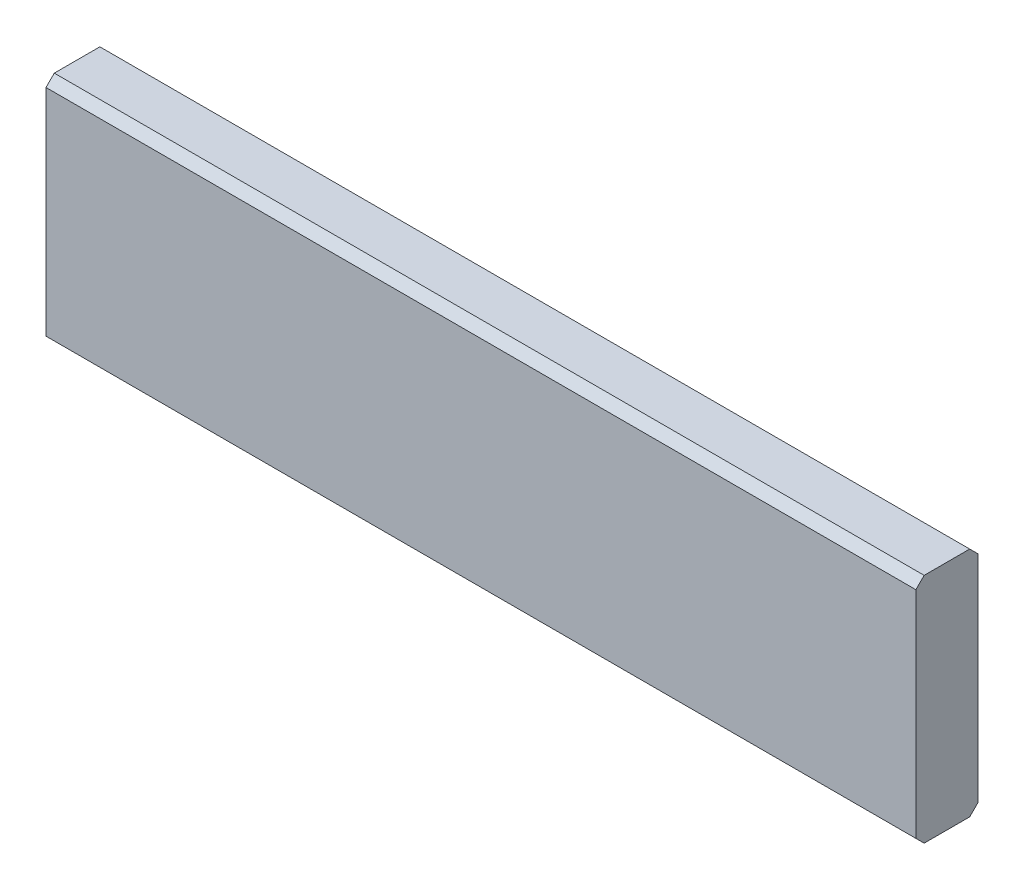
ISO-10303-21;
HEADER;
FILE_DESCRIPTION(('STEP AP214'),'2;1');
FILE_NAME('part.step','',(''),(''),'','','');
FILE_SCHEMA(('AUTOMOTIVE_DESIGN { 1 0 10303 214 1 1 1 1 }'));
ENDSEC;
DATA;
#1=APPLICATION_CONTEXT('core data for automotive mechanical design processes');
#2=APPLICATION_PROTOCOL_DEFINITION('international standard','automotive_design',2000,#1);
#3=PRODUCT_CONTEXT('',#1,'mechanical');
#4=PRODUCT('Part','Part','',(#3));
#5=PRODUCT_RELATED_PRODUCT_CATEGORY('part','',(#4));
#6=PRODUCT_DEFINITION_FORMATION('','',#4);
#7=PRODUCT_DEFINITION_CONTEXT('part definition',#1,'design');
#8=PRODUCT_DEFINITION('design','',#6,#7);
#9=PRODUCT_DEFINITION_SHAPE('','',#8);
#10=(LENGTH_UNIT() NAMED_UNIT(*) SI_UNIT(.MILLI.,.METRE.));
#11=(NAMED_UNIT(*) PLANE_ANGLE_UNIT() SI_UNIT($,.RADIAN.));
#12=(NAMED_UNIT(*) SI_UNIT($,.STERADIAN.) SOLID_ANGLE_UNIT());
#13=UNCERTAINTY_MEASURE_WITH_UNIT(LENGTH_MEASURE(1.E-05),#10,'distance_accuracy_value','');
#14=(GEOMETRIC_REPRESENTATION_CONTEXT(3) GLOBAL_UNCERTAINTY_ASSIGNED_CONTEXT((#13)) GLOBAL_UNIT_ASSIGNED_CONTEXT((#10,
#11,#12)) REPRESENTATION_CONTEXT('',''));
#15=CARTESIAN_POINT('',(0.,0.,0.));
#16=DIRECTION('',(0.,0.,1.));
#17=DIRECTION('',(1.,0.,0.));
#18=AXIS2_PLACEMENT_3D('',#15,#16,#17);
#19=CARTESIAN_POINT('',(-31.15,-16.05,10.1));
#20=DIRECTION('',(0.,-0.707106781186548,0.707106781186548));
#21=DIRECTION('',(1.,0.,0.));
#22=AXIS2_PLACEMENT_3D('',#19,#20,#21);
#23=PLANE('',#22);
#24=DIRECTION('',(-1.,0.,0.));
#25=VECTOR('',#24,1.);
#26=CARTESIAN_POINT('',(31.85,-15.55,10.6));
#27=LINE('',#26,#25);
#28=CARTESIAN_POINT('',(31.85,-15.55,10.6));
#29=VERTEX_POINT('',#28);
#30=CARTESIAN_POINT('',(-20.65,-15.55,10.6));
#31=VERTEX_POINT('',#30);
#32=EDGE_CURVE('E11',#29,#31,#27,.T.);
#33=ORIENTED_EDGE('',*,*,#32,.T.);
#34=DIRECTION('',(0.,0.707106781186548,0.707106781186548));
#35=VECTOR('',#34,1.);
#36=CARTESIAN_POINT('',(-20.65,-16.05,10.1));
#37=LINE('',#36,#35);
#38=CARTESIAN_POINT('',(-20.65,-16.05,10.1));
#39=VERTEX_POINT('',#38);
#40=EDGE_CURVE('E36',#39,#31,#37,.T.);
#41=ORIENTED_EDGE('',*,*,#40,.F.);
#42=DIRECTION('',(-1.,0.,0.));
#43=VECTOR('',#42,1.);
#44=CARTESIAN_POINT('',(31.85,-16.05,10.1));
#45=LINE('',#44,#43);
#46=CARTESIAN_POINT('',(31.85,-16.05,10.1));
#47=VERTEX_POINT('',#46);
#48=EDGE_CURVE('E89',#47,#39,#45,.T.);
#49=ORIENTED_EDGE('',*,*,#48,.F.);
#50=DIRECTION('',(0.,-0.707106781186548,-0.707106781186548));
#51=VECTOR('',#50,1.);
#52=CARTESIAN_POINT('',(31.85,-15.55,10.6));
#53=LINE('',#52,#51);
#54=EDGE_CURVE('E149',#29,#47,#53,.T.);
#55=ORIENTED_EDGE('',*,*,#54,.F.);
#56=EDGE_LOOP('',(#33,#41,#49,#55));
#57=FACE_BOUND('',#56,.T.);
#58=ADVANCED_FACE('F17',(#57),#23,.T.);
#59=CARTESIAN_POINT('',(31.85,-0.3,1.6));
#60=DIRECTION('',(-1.,0.,0.));
#61=DIRECTION('',(0.,-1.,0.));
#62=AXIS2_PLACEMENT_3D('',#59,#60,#61);
#63=PLANE('',#62);
#64=DIRECTION('',(0.,-1.,0.));
#65=VECTOR('',#64,1.);
#66=CARTESIAN_POINT('',(31.85,-2.55,10.6));
#67=LINE('',#66,#65);
#68=CARTESIAN_POINT('',(31.85,-2.55,10.6));
#69=VERTEX_POINT('',#68);
#70=EDGE_CURVE('E27',#69,#29,#67,.T.);
#71=ORIENTED_EDGE('',*,*,#70,.T.);
#72=ORIENTED_EDGE('',*,*,#54,.T.);
#73=DIRECTION('',(0.,0.,-1.));
#74=VECTOR('',#73,1.);
#75=CARTESIAN_POINT('',(31.85,-16.05,10.1));
#76=LINE('',#75,#74);
#77=CARTESIAN_POINT('',(31.85,-16.05,7.35));
#78=VERTEX_POINT('',#77);
#79=EDGE_CURVE('E152',#47,#78,#76,.T.);
#80=ORIENTED_EDGE('',*,*,#79,.T.);
#81=DIRECTION('',(0.,0.707106781186548,-0.707106781186548));
#82=VECTOR('',#81,1.);
#83=CARTESIAN_POINT('',(31.85,-16.05,7.35));
#84=LINE('',#83,#82);
#85=CARTESIAN_POINT('',(31.85,-15.55,6.85));
#86=VERTEX_POINT('',#85);
#87=EDGE_CURVE('E99',#78,#86,#84,.T.);
#88=ORIENTED_EDGE('',*,*,#87,.T.);
#89=DIRECTION('',(0.,-1.,0.));
#90=VECTOR('',#89,1.);
#91=CARTESIAN_POINT('',(31.85,-2.55,6.85));
#92=LINE('',#91,#90);
#93=CARTESIAN_POINT('',(31.85,-2.55,6.85));
#94=VERTEX_POINT('',#93);
#95=EDGE_CURVE('E103',#94,#86,#92,.T.);
#96=ORIENTED_EDGE('',*,*,#95,.F.);
#97=DIRECTION('',(0.,0.707106781186548,0.707106781186548));
#98=VECTOR('',#97,1.);
#99=CARTESIAN_POINT('',(31.85,-2.55,6.85));
#100=LINE('',#99,#98);
#101=CARTESIAN_POINT('',(31.85,-2.05,7.35));
#102=VERTEX_POINT('',#101);
#103=EDGE_CURVE('E122',#94,#102,#100,.T.);
#104=ORIENTED_EDGE('',*,*,#103,.T.);
#105=DIRECTION('',(0.,0.,-1.));
#106=VECTOR('',#105,1.);
#107=CARTESIAN_POINT('',(31.85,-2.05,10.1));
#108=LINE('',#107,#106);
#109=CARTESIAN_POINT('',(31.85,-2.05,10.1));
#110=VERTEX_POINT('',#109);
#111=EDGE_CURVE('E109',#110,#102,#108,.T.);
#112=ORIENTED_EDGE('',*,*,#111,.F.);
#113=DIRECTION('',(0.,-0.707106781186548,0.707106781186548));
#114=VECTOR('',#113,1.);
#115=CARTESIAN_POINT('',(31.85,-2.05,10.1));
#116=LINE('',#115,#114);
#117=EDGE_CURVE('E123',#110,#69,#116,.T.);
#118=ORIENTED_EDGE('',*,*,#117,.T.);
#119=EDGE_LOOP('',(#71,#72,#80,#88,#96,#104,#112,#118));
#120=FACE_BOUND('',#119,.T.);
#121=ADVANCED_FACE('F157',(#120),#63,.F.);
#122=CARTESIAN_POINT('',(42.35,-2.05,10.1));
#123=DIRECTION('',(0.,0.707106781186548,0.707106781186548));
#124=DIRECTION('',(-1.,0.,0.));
#125=AXIS2_PLACEMENT_3D('',#122,#123,#124);
#126=PLANE('',#125);
#127=DIRECTION('',(1.,0.,0.));
#128=VECTOR('',#127,1.);
#129=CARTESIAN_POINT('',(-20.65,-2.55,10.6));
#130=LINE('',#129,#128);
#131=CARTESIAN_POINT('',(-20.65,-2.55,10.6));
#132=VERTEX_POINT('',#131);
#133=EDGE_CURVE('E125',#132,#69,#130,.T.);
#134=ORIENTED_EDGE('',*,*,#133,.T.);
#135=ORIENTED_EDGE('',*,*,#117,.F.);
#136=DIRECTION('',(1.,0.,0.));
#137=VECTOR('',#136,1.);
#138=CARTESIAN_POINT('',(-20.65,-2.05,10.1));
#139=LINE('',#138,#137);
#140=CARTESIAN_POINT('',(-20.65,-2.05,10.1));
#141=VERTEX_POINT('',#140);
#142=EDGE_CURVE('E119',#141,#110,#139,.T.);
#143=ORIENTED_EDGE('',*,*,#142,.F.);
#144=DIRECTION('',(0.,0.707106781186548,-0.707106781186548));
#145=VECTOR('',#144,1.);
#146=CARTESIAN_POINT('',(-20.65,-2.55,10.6));
#147=LINE('',#146,#145);
#148=EDGE_CURVE('E130',#132,#141,#147,.T.);
#149=ORIENTED_EDGE('',*,*,#148,.F.);
#150=EDGE_LOOP('',(#134,#135,#143,#149));
#151=FACE_BOUND('',#150,.T.);
#152=ADVANCED_FACE('F141',(#151),#126,.T.);
#153=CARTESIAN_POINT('',(-20.65,-17.8,1.6));
#154=DIRECTION('',(1.,0.,0.));
#155=DIRECTION('',(0.,1.,0.));
#156=AXIS2_PLACEMENT_3D('',#153,#154,#155);
#157=PLANE('',#156);
#158=DIRECTION('',(0.,0.,-1.));
#159=VECTOR('',#158,1.);
#160=CARTESIAN_POINT('',(-20.65,-2.05,10.1));
#161=LINE('',#160,#159);
#162=CARTESIAN_POINT('',(-20.65,-2.05,7.35));
#163=VERTEX_POINT('',#162);
#164=EDGE_CURVE('E128',#141,#163,#161,.T.);
#165=ORIENTED_EDGE('',*,*,#164,.T.);
#166=DIRECTION('',(0.,-0.707106781186548,-0.707106781186548));
#167=VECTOR('',#166,1.);
#168=CARTESIAN_POINT('',(-20.65,-2.05,7.35));
#169=LINE('',#168,#167);
#170=CARTESIAN_POINT('',(-20.65,-2.55,6.85));
#171=VERTEX_POINT('',#170);
#172=EDGE_CURVE('E134',#163,#171,#169,.T.);
#173=ORIENTED_EDGE('',*,*,#172,.T.);
#174=DIRECTION('',(0.,-1.,0.));
#175=VECTOR('',#174,1.);
#176=CARTESIAN_POINT('',(-20.65,-2.55,6.85));
#177=LINE('',#176,#175);
#178=CARTESIAN_POINT('',(-20.65,-15.55,6.85));
#179=VERTEX_POINT('',#178);
#180=EDGE_CURVE('E94',#171,#179,#177,.T.);
#181=ORIENTED_EDGE('',*,*,#180,.T.);
#182=DIRECTION('',(0.,-0.707106781186548,0.707106781186548));
#183=VECTOR('',#182,1.);
#184=CARTESIAN_POINT('',(-20.65,-15.55,6.85));
#185=LINE('',#184,#183);
#186=CARTESIAN_POINT('',(-20.65,-16.05,7.35));
#187=VERTEX_POINT('',#186);
#188=EDGE_CURVE('E80',#179,#187,#185,.T.);
#189=ORIENTED_EDGE('',*,*,#188,.T.);
#190=DIRECTION('',(0.,0.,-1.));
#191=VECTOR('',#190,1.);
#192=CARTESIAN_POINT('',(-20.65,-16.05,10.1));
#193=LINE('',#192,#191);
#194=EDGE_CURVE('E85',#39,#187,#193,.T.);
#195=ORIENTED_EDGE('',*,*,#194,.F.);
#196=ORIENTED_EDGE('',*,*,#40,.T.);
#197=DIRECTION('',(0.,1.,0.));
#198=VECTOR('',#197,1.);
#199=CARTESIAN_POINT('',(-20.65,-15.55,10.6));
#200=LINE('',#199,#198);
#201=EDGE_CURVE('E106',#31,#132,#200,.T.);
#202=ORIENTED_EDGE('',*,*,#201,.T.);
#203=ORIENTED_EDGE('',*,*,#148,.T.);
#204=EDGE_LOOP('',(#165,#173,#181,#189,#195,#196,#202,#203));
#205=FACE_BOUND('',#204,.T.);
#206=ADVANCED_FACE('F92',(#205),#157,.F.);
#207=CARTESIAN_POINT('',(0.,0.,10.6));
#208=DIRECTION('',(0.,0.,1.));
#209=DIRECTION('',(1.,0.,0.));
#210=AXIS2_PLACEMENT_3D('',#207,#208,#209);
#211=PLANE('',#210);
#212=ORIENTED_EDGE('',*,*,#32,.F.);
#213=ORIENTED_EDGE('',*,*,#70,.F.);
#214=ORIENTED_EDGE('',*,*,#133,.F.);
#215=ORIENTED_EDGE('',*,*,#201,.F.);
#216=EDGE_LOOP('',(#212,#213,#214,#215));
#217=FACE_BOUND('',#216,.T.);
#218=ADVANCED_FACE('F180',(#217),#211,.T.);
#219=CARTESIAN_POINT('',(31.85,-16.05,6.6));
#220=DIRECTION('',(0.,1.,0.));
#221=DIRECTION('',(-1.,0.,0.));
#222=AXIS2_PLACEMENT_3D('',#219,#220,#221);
#223=PLANE('',#222);
#224=ORIENTED_EDGE('',*,*,#79,.F.);
#225=ORIENTED_EDGE('',*,*,#48,.T.);
#226=ORIENTED_EDGE('',*,*,#194,.T.);
#227=DIRECTION('',(1.,0.,0.));
#228=VECTOR('',#227,1.);
#229=CARTESIAN_POINT('',(-20.65,-16.05,7.35));
#230=LINE('',#229,#228);
#231=EDGE_CURVE('E88',#187,#78,#230,.T.);
#232=ORIENTED_EDGE('',*,*,#231,.T.);
#233=EDGE_LOOP('',(#224,#225,#226,#232));
#234=FACE_BOUND('',#233,.T.);
#235=ADVANCED_FACE('F87',(#234),#223,.F.);
#236=CARTESIAN_POINT('',(-31.15,-16.05,7.35));
#237=DIRECTION('',(0.,0.707106781186548,0.707106781186548));
#238=DIRECTION('',(1.,0.,0.));
#239=AXIS2_PLACEMENT_3D('',#236,#237,#238);
#240=PLANE('',#239);
#241=ORIENTED_EDGE('',*,*,#87,.F.);
#242=ORIENTED_EDGE('',*,*,#231,.F.);
#243=ORIENTED_EDGE('',*,*,#188,.F.);
#244=DIRECTION('',(1.,0.,0.));
#245=VECTOR('',#244,1.);
#246=CARTESIAN_POINT('',(-20.65,-15.55,6.85));
#247=LINE('',#246,#245);
#248=EDGE_CURVE('E101',#179,#86,#247,.T.);
#249=ORIENTED_EDGE('',*,*,#248,.T.);
#250=EDGE_LOOP('',(#241,#242,#243,#249));
#251=FACE_BOUND('',#250,.T.);
#252=ADVANCED_FACE('F97',(#251),#240,.F.);
#253=CARTESIAN_POINT('',(-23.8531627655,-17.8,6.85));
#254=DIRECTION('',(0.,0.,1.));
#255=DIRECTION('',(1.,0.,0.));
#256=AXIS2_PLACEMENT_3D('',#253,#254,#255);
#257=PLANE('',#256);
#258=ORIENTED_EDGE('',*,*,#95,.T.);
#259=ORIENTED_EDGE('',*,*,#248,.F.);
#260=ORIENTED_EDGE('',*,*,#180,.F.);
#261=DIRECTION('',(-1.,0.,0.));
#262=VECTOR('',#261,1.);
#263=CARTESIAN_POINT('',(31.85,-2.55,6.85));
#264=LINE('',#263,#262);
#265=EDGE_CURVE('E107',#94,#171,#264,.T.);
#266=ORIENTED_EDGE('',*,*,#265,.F.);
#267=EDGE_LOOP('',(#258,#259,#260,#266));
#268=FACE_BOUND('',#267,.T.);
#269=ADVANCED_FACE('F159',(#268),#257,.F.);
#270=CARTESIAN_POINT('',(42.35,-2.05,7.35));
#271=DIRECTION('',(0.,-0.707106781186548,0.707106781186548));
#272=DIRECTION('',(-1.,0.,0.));
#273=AXIS2_PLACEMENT_3D('',#270,#271,#272);
#274=PLANE('',#273);
#275=ORIENTED_EDGE('',*,*,#172,.F.);
#276=DIRECTION('',(-1.,0.,0.));
#277=VECTOR('',#276,1.);
#278=CARTESIAN_POINT('',(31.85,-2.05,7.35));
#279=LINE('',#278,#277);
#280=EDGE_CURVE('E21',#102,#163,#279,.T.);
#281=ORIENTED_EDGE('',*,*,#280,.F.);
#282=ORIENTED_EDGE('',*,*,#103,.F.);
#283=ORIENTED_EDGE('',*,*,#265,.T.);
#284=EDGE_LOOP('',(#275,#281,#282,#283));
#285=FACE_BOUND('',#284,.T.);
#286=ADVANCED_FACE('F138',(#285),#274,.F.);
#287=CARTESIAN_POINT('',(-20.65,-2.05,6.6));
#288=DIRECTION('',(0.,-1.,0.));
#289=DIRECTION('',(1.,0.,0.));
#290=AXIS2_PLACEMENT_3D('',#287,#288,#289);
#291=PLANE('',#290);
#292=ORIENTED_EDGE('',*,*,#111,.T.);
#293=ORIENTED_EDGE('',*,*,#280,.T.);
#294=ORIENTED_EDGE('',*,*,#164,.F.);
#295=ORIENTED_EDGE('',*,*,#142,.T.);
#296=EDGE_LOOP('',(#292,#293,#294,#295));
#297=FACE_BOUND('',#296,.T.);
#298=ADVANCED_FACE('F19',(#297),#291,.F.);
#299=CLOSED_SHELL('',(#58,#121,#152,#206,#218,#235,#252,#269,#286,#298));
#300=MANIFOLD_SOLID_BREP('B1',#299);
#301=ADVANCED_BREP_SHAPE_REPRESENTATION('',(#18,#300),#14);
#302=SHAPE_DEFINITION_REPRESENTATION(#9,#301);
ENDSEC;
END-ISO-10303-21;
